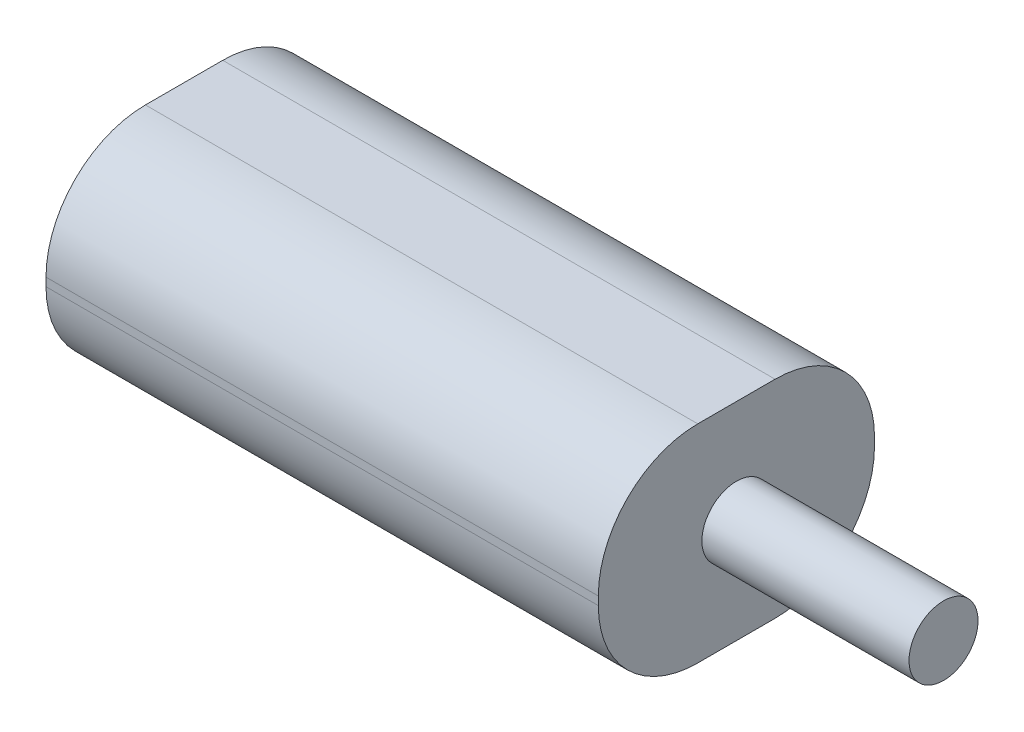
ISO-10303-21;
HEADER;
FILE_DESCRIPTION(('STEP AP214'),'2;1');
FILE_NAME('part.step','',(''),(''),'','','');
FILE_SCHEMA(('AUTOMOTIVE_DESIGN { 1 0 10303 214 1 1 1 1 }'));
ENDSEC;
DATA;
#1=APPLICATION_CONTEXT('core data for automotive mechanical design processes');
#2=APPLICATION_PROTOCOL_DEFINITION('international standard','automotive_design',2000,#1);
#3=PRODUCT_CONTEXT('',#1,'mechanical');
#4=PRODUCT('Part','Part','',(#3));
#5=PRODUCT_RELATED_PRODUCT_CATEGORY('part','',(#4));
#6=PRODUCT_DEFINITION_FORMATION('','',#4);
#7=PRODUCT_DEFINITION_CONTEXT('part definition',#1,'design');
#8=PRODUCT_DEFINITION('design','',#6,#7);
#9=PRODUCT_DEFINITION_SHAPE('','',#8);
#10=(LENGTH_UNIT() NAMED_UNIT(*) SI_UNIT(.MILLI.,.METRE.));
#11=(NAMED_UNIT(*) PLANE_ANGLE_UNIT() SI_UNIT($,.RADIAN.));
#12=(NAMED_UNIT(*) SI_UNIT($,.STERADIAN.) SOLID_ANGLE_UNIT());
#13=UNCERTAINTY_MEASURE_WITH_UNIT(LENGTH_MEASURE(1.E-05),#10,'distance_accuracy_value','');
#14=(GEOMETRIC_REPRESENTATION_CONTEXT(3) GLOBAL_UNCERTAINTY_ASSIGNED_CONTEXT((#13)) GLOBAL_UNIT_ASSIGNED_CONTEXT((#10,
#11,#12)) REPRESENTATION_CONTEXT('',''));
#15=CARTESIAN_POINT('',(0.,0.,0.));
#16=DIRECTION('',(0.,0.,1.));
#17=DIRECTION('',(1.,0.,0.));
#18=AXIS2_PLACEMENT_3D('',#15,#16,#17);
#19=CARTESIAN_POINT('',(-12.7,9.525,-6.35));
#20=DIRECTION('',(1.,0.,0.));
#21=DIRECTION('',(0.,0.,-1.));
#22=AXIS2_PLACEMENT_3D('',#19,#20,#21);
#23=PLANE('',#22);
#24=DIRECTION('',(0.,0.,1.));
#25=VECTOR('',#24,1.);
#26=CARTESIAN_POINT('',(-12.7,9.525,-6.35));
#27=LINE('',#26,#25);
#28=CARTESIAN_POINT('',(-12.7,9.525,-1.778));
#29=VERTEX_POINT('',#28);
#30=CARTESIAN_POINT('',(-12.7,9.525,1.778));
#31=VERTEX_POINT('',#30);
#32=EDGE_CURVE('E120',#29,#31,#27,.T.);
#33=ORIENTED_EDGE('',*,*,#32,.F.);
#34=CARTESIAN_POINT('',(-12.7,4.953,-1.778));
#35=DIRECTION('',(1.,0.,0.));
#36=DIRECTION('',(0.,0.,-1.));
#37=AXIS2_PLACEMENT_3D('',#34,#35,#36);
#38=CIRCLE('',#37,4.572);
#39=CARTESIAN_POINT('',(-12.7,4.953,-6.35));
#40=VERTEX_POINT('',#39);
#41=EDGE_CURVE('E102',#29,#40,#38,.F.);
#42=ORIENTED_EDGE('',*,*,#41,.T.);
#43=DIRECTION('',(0.,-1.,0.));
#44=VECTOR('',#43,1.);
#45=CARTESIAN_POINT('',(-12.7,9.525,-6.35));
#46=LINE('',#45,#44);
#47=CARTESIAN_POINT('',(-12.7,4.572,-6.35));
#48=VERTEX_POINT('',#47);
#49=EDGE_CURVE('E130',#40,#48,#46,.T.);
#50=ORIENTED_EDGE('',*,*,#49,.T.);
#51=CARTESIAN_POINT('',(-12.7,4.572,-1.778));
#52=DIRECTION('',(1.,0.,0.));
#53=DIRECTION('',(0.,0.,-1.));
#54=AXIS2_PLACEMENT_3D('',#51,#52,#53);
#55=CIRCLE('',#54,4.572);
#56=CARTESIAN_POINT('',(-12.7,0.,-1.778));
#57=VERTEX_POINT('',#56);
#58=EDGE_CURVE('E113',#48,#57,#55,.F.);
#59=ORIENTED_EDGE('',*,*,#58,.T.);
#60=DIRECTION('',(0.,0.,1.));
#61=VECTOR('',#60,1.);
#62=CARTESIAN_POINT('',(-12.7,0.,-6.35));
#63=LINE('',#62,#61);
#64=CARTESIAN_POINT('',(-12.7,0.,1.778));
#65=VERTEX_POINT('',#64);
#66=EDGE_CURVE('E133',#57,#65,#63,.T.);
#67=ORIENTED_EDGE('',*,*,#66,.T.);
#68=CARTESIAN_POINT('',(-12.7,4.572,1.778));
#69=DIRECTION('',(1.,0.,0.));
#70=DIRECTION('',(0.,0.,-1.));
#71=AXIS2_PLACEMENT_3D('',#68,#69,#70);
#72=CIRCLE('',#71,4.572);
#73=CARTESIAN_POINT('',(-12.7,4.572,6.35));
#74=VERTEX_POINT('',#73);
#75=EDGE_CURVE('E153',#65,#74,#72,.F.);
#76=ORIENTED_EDGE('',*,*,#75,.T.);
#77=DIRECTION('',(0.,-1.,0.));
#78=VECTOR('',#77,1.);
#79=CARTESIAN_POINT('',(-12.7,9.525,6.35));
#80=LINE('',#79,#78);
#81=CARTESIAN_POINT('',(-12.7,4.953,6.35));
#82=VERTEX_POINT('',#81);
#83=EDGE_CURVE('E148',#82,#74,#80,.T.);
#84=ORIENTED_EDGE('',*,*,#83,.F.);
#85=CARTESIAN_POINT('',(-12.7,4.953,1.778));
#86=DIRECTION('',(1.,0.,0.));
#87=DIRECTION('',(0.,0.,-1.));
#88=AXIS2_PLACEMENT_3D('',#85,#86,#87);
#89=CIRCLE('',#88,4.572);
#90=EDGE_CURVE('E123',#82,#31,#89,.F.);
#91=ORIENTED_EDGE('',*,*,#90,.T.);
#92=EDGE_LOOP('',(#33,#42,#50,#59,#67,#76,#84,#91));
#93=FACE_BOUND('',#92,.T.);
#94=ADVANCED_FACE('F36',(#93),#23,.F.);
#95=CARTESIAN_POINT('',(-12.7,9.525,6.35));
#96=DIRECTION('',(0.,0.,-1.));
#97=DIRECTION('',(-1.,0.,0.));
#98=AXIS2_PLACEMENT_3D('',#95,#96,#97);
#99=PLANE('',#98);
#100=ORIENTED_EDGE('',*,*,#83,.T.);
#101=DIRECTION('',(1.,0.,0.));
#102=VECTOR('',#101,1.);
#103=CARTESIAN_POINT('',(-12.7,4.572,6.35));
#104=LINE('',#103,#102);
#105=CARTESIAN_POINT('',(12.7,4.572,6.35));
#106=VERTEX_POINT('',#105);
#107=EDGE_CURVE('E11',#74,#106,#104,.T.);
#108=ORIENTED_EDGE('',*,*,#107,.T.);
#109=DIRECTION('',(0.,-1.,0.));
#110=VECTOR('',#109,1.);
#111=CARTESIAN_POINT('',(12.7,9.525,6.35));
#112=LINE('',#111,#110);
#113=CARTESIAN_POINT('',(12.7,4.953,6.35));
#114=VERTEX_POINT('',#113);
#115=EDGE_CURVE('E146',#114,#106,#112,.T.);
#116=ORIENTED_EDGE('',*,*,#115,.F.);
#117=DIRECTION('',(1.,0.,0.));
#118=VECTOR('',#117,1.);
#119=CARTESIAN_POINT('',(-12.7,4.953,6.35));
#120=LINE('',#119,#118);
#121=EDGE_CURVE('E44',#114,#82,#120,.F.);
#122=ORIENTED_EDGE('',*,*,#121,.T.);
#123=EDGE_LOOP('',(#100,#108,#116,#122));
#124=FACE_BOUND('',#123,.T.);
#125=ADVANCED_FACE('F170',(#124),#99,.F.);
#126=CARTESIAN_POINT('',(12.7,9.525,-6.35));
#127=DIRECTION('',(-1.,0.,0.));
#128=DIRECTION('',(0.,0.,1.));
#129=AXIS2_PLACEMENT_3D('',#126,#127,#128);
#130=PLANE('',#129);
#131=CARTESIAN_POINT('',(12.7,4.7625,0.));
#132=DIRECTION('',(1.,0.,0.));
#133=DIRECTION('',(0.,0.,-1.));
#134=AXIS2_PLACEMENT_3D('',#131,#132,#133);
#135=CIRCLE('',#134,1.5875);
#136=CARTESIAN_POINT('',(12.7,4.7625,1.5875));
#137=VERTEX_POINT('',#136);
#138=EDGE_CURVE('E136',#137,#137,#135,.T.);
#139=ORIENTED_EDGE('',*,*,#138,.F.);
#140=EDGE_LOOP('',(#139));
#141=FACE_BOUND('',#140,.T.);
#142=DIRECTION('',(0.,-1.,0.));
#143=VECTOR('',#142,1.);
#144=CARTESIAN_POINT('',(12.7,9.525,-6.35));
#145=LINE('',#144,#143);
#146=CARTESIAN_POINT('',(12.7,4.953,-6.35));
#147=VERTEX_POINT('',#146);
#148=CARTESIAN_POINT('',(12.7,4.572,-6.35));
#149=VERTEX_POINT('',#148);
#150=EDGE_CURVE('E143',#147,#149,#145,.T.);
#151=ORIENTED_EDGE('',*,*,#150,.F.);
#152=CARTESIAN_POINT('',(12.7,4.953,-1.778));
#153=DIRECTION('',(-1.,0.,0.));
#154=DIRECTION('',(0.,0.,1.));
#155=AXIS2_PLACEMENT_3D('',#152,#153,#154);
#156=CIRCLE('',#155,4.572);
#157=CARTESIAN_POINT('',(12.7,9.525,-1.778));
#158=VERTEX_POINT('',#157);
#159=EDGE_CURVE('E163',#147,#158,#156,.F.);
#160=ORIENTED_EDGE('',*,*,#159,.T.);
#161=DIRECTION('',(0.,0.,-1.));
#162=VECTOR('',#161,1.);
#163=CARTESIAN_POINT('',(12.7,9.525,-6.35));
#164=LINE('',#163,#162);
#165=CARTESIAN_POINT('',(12.7,9.525,1.778));
#166=VERTEX_POINT('',#165);
#167=EDGE_CURVE('E122',#166,#158,#164,.T.);
#168=ORIENTED_EDGE('',*,*,#167,.F.);
#169=CARTESIAN_POINT('',(12.7,4.953,1.778));
#170=DIRECTION('',(-1.,0.,0.));
#171=DIRECTION('',(0.,0.,1.));
#172=AXIS2_PLACEMENT_3D('',#169,#170,#171);
#173=CIRCLE('',#172,4.572);
#174=EDGE_CURVE('E58',#166,#114,#173,.F.);
#175=ORIENTED_EDGE('',*,*,#174,.T.);
#176=ORIENTED_EDGE('',*,*,#115,.T.);
#177=CARTESIAN_POINT('',(12.7,4.572,1.778));
#178=DIRECTION('',(-1.,0.,0.));
#179=DIRECTION('',(0.,0.,1.));
#180=AXIS2_PLACEMENT_3D('',#177,#178,#179);
#181=CIRCLE('',#180,4.572);
#182=CARTESIAN_POINT('',(12.7,0.,1.778));
#183=VERTEX_POINT('',#182);
#184=EDGE_CURVE('E51',#106,#183,#181,.F.);
#185=ORIENTED_EDGE('',*,*,#184,.T.);
#186=DIRECTION('',(0.,0.,-1.));
#187=VECTOR('',#186,1.);
#188=CARTESIAN_POINT('',(12.7,0.,-6.35));
#189=LINE('',#188,#187);
#190=CARTESIAN_POINT('',(12.7,0.,-1.778));
#191=VERTEX_POINT('',#190);
#192=EDGE_CURVE('E128',#183,#191,#189,.T.);
#193=ORIENTED_EDGE('',*,*,#192,.T.);
#194=CARTESIAN_POINT('',(12.7,4.572,-1.778));
#195=DIRECTION('',(-1.,0.,0.));
#196=DIRECTION('',(0.,0.,1.));
#197=AXIS2_PLACEMENT_3D('',#194,#195,#196);
#198=CIRCLE('',#197,4.572);
#199=EDGE_CURVE('E161',#191,#149,#198,.F.);
#200=ORIENTED_EDGE('',*,*,#199,.T.);
#201=EDGE_LOOP('',(#151,#160,#168,#175,#176,#185,#193,#200));
#202=FACE_BOUND('',#201,.T.);
#203=ADVANCED_FACE('F174',(#141,#202),#130,.F.);
#204=CARTESIAN_POINT('',(-12.7,9.525,-6.35));
#205=DIRECTION('',(0.,0.,1.));
#206=DIRECTION('',(1.,0.,0.));
#207=AXIS2_PLACEMENT_3D('',#204,#205,#206);
#208=PLANE('',#207);
#209=ORIENTED_EDGE('',*,*,#49,.F.);
#210=DIRECTION('',(-1.,0.,0.));
#211=VECTOR('',#210,1.);
#212=CARTESIAN_POINT('',(12.7,4.953,-6.35));
#213=LINE('',#212,#211);
#214=EDGE_CURVE('E107',#40,#147,#213,.F.);
#215=ORIENTED_EDGE('',*,*,#214,.T.);
#216=ORIENTED_EDGE('',*,*,#150,.T.);
#217=DIRECTION('',(-1.,0.,0.));
#218=VECTOR('',#217,1.);
#219=CARTESIAN_POINT('',(-12.7,4.572,-6.35));
#220=LINE('',#219,#218);
#221=EDGE_CURVE('E112',#149,#48,#220,.T.);
#222=ORIENTED_EDGE('',*,*,#221,.T.);
#223=EDGE_LOOP('',(#209,#215,#216,#222));
#224=FACE_BOUND('',#223,.T.);
#225=ADVANCED_FACE('F178',(#224),#208,.F.);
#226=CARTESIAN_POINT('',(0.,9.525,0.));
#227=DIRECTION('',(0.,1.,0.));
#228=DIRECTION('',(0.,0.,1.));
#229=AXIS2_PLACEMENT_3D('',#226,#227,#228);
#230=PLANE('',#229);
#231=ORIENTED_EDGE('',*,*,#167,.T.);
#232=DIRECTION('',(-1.,0.,0.));
#233=VECTOR('',#232,1.);
#234=CARTESIAN_POINT('',(-12.7,9.525,-1.778));
#235=LINE('',#234,#233);
#236=EDGE_CURVE('E106',#158,#29,#235,.T.);
#237=ORIENTED_EDGE('',*,*,#236,.T.);
#238=ORIENTED_EDGE('',*,*,#32,.T.);
#239=DIRECTION('',(1.,0.,0.));
#240=VECTOR('',#239,1.);
#241=CARTESIAN_POINT('',(12.7,9.525,1.778));
#242=LINE('',#241,#240);
#243=EDGE_CURVE('E124',#31,#166,#242,.T.);
#244=ORIENTED_EDGE('',*,*,#243,.T.);
#245=EDGE_LOOP('',(#231,#237,#238,#244));
#246=FACE_BOUND('',#245,.T.);
#247=ADVANCED_FACE('F118',(#246),#230,.T.);
#248=CARTESIAN_POINT('',(0.,0.,0.));
#249=DIRECTION('',(0.,1.,0.));
#250=DIRECTION('',(0.,0.,1.));
#251=AXIS2_PLACEMENT_3D('',#248,#249,#250);
#252=PLANE('',#251);
#253=ORIENTED_EDGE('',*,*,#66,.F.);
#254=DIRECTION('',(-1.,0.,0.));
#255=VECTOR('',#254,1.);
#256=CARTESIAN_POINT('',(0.,0.,-1.778));
#257=LINE('',#256,#255);
#258=EDGE_CURVE('E167',#57,#191,#257,.F.);
#259=ORIENTED_EDGE('',*,*,#258,.T.);
#260=ORIENTED_EDGE('',*,*,#192,.F.);
#261=DIRECTION('',(1.,0.,0.));
#262=VECTOR('',#261,1.);
#263=CARTESIAN_POINT('',(0.,0.,1.778));
#264=LINE('',#263,#262);
#265=EDGE_CURVE('E165',#183,#65,#264,.F.);
#266=ORIENTED_EDGE('',*,*,#265,.T.);
#267=EDGE_LOOP('',(#253,#259,#260,#266));
#268=FACE_BOUND('',#267,.T.);
#269=ADVANCED_FACE('F184',(#268),#252,.F.);
#270=CARTESIAN_POINT('',(22.225,4.7625,0.));
#271=DIRECTION('',(-1.,0.,0.));
#272=DIRECTION('',(0.,0.,1.));
#273=AXIS2_PLACEMENT_3D('',#270,#271,#272);
#274=CYLINDRICAL_SURFACE('',#273,1.5875);
#275=CARTESIAN_POINT('',(22.225,4.7625,0.));
#276=DIRECTION('',(1.,0.,0.));
#277=DIRECTION('',(0.,0.,-1.));
#278=AXIS2_PLACEMENT_3D('',#275,#276,#277);
#279=CIRCLE('',#278,1.5875);
#280=CARTESIAN_POINT('',(22.225,4.7625,1.5875));
#281=VERTEX_POINT('',#280);
#282=EDGE_CURVE('E140',#281,#281,#279,.T.);
#283=CARTESIAN_POINT('',(22.225,4.7625,1.5875));
#284=CARTESIAN_POINT('',(22.12578125,4.7625,1.5875));
#285=CARTESIAN_POINT('',(22.0265625,4.7625,1.5875));
#286=CARTESIAN_POINT('',(21.828125,4.7625,1.5875));
#287=CARTESIAN_POINT('',(21.72890625,4.7625,1.5875));
#288=CARTESIAN_POINT('',(21.53046875,4.7625,1.5875));
#289=CARTESIAN_POINT('',(21.43125,4.7625,1.5875));
#290=CARTESIAN_POINT('',(21.2328125,4.7625,1.5875));
#291=CARTESIAN_POINT('',(21.13359375,4.7625,1.5875));
#292=CARTESIAN_POINT('',(20.93515625,4.7625,1.5875));
#293=CARTESIAN_POINT('',(20.8359375,4.7625,1.5875));
#294=CARTESIAN_POINT('',(20.6375,4.7625,1.5875));
#295=CARTESIAN_POINT('',(20.53828125,4.7625,1.5875));
#296=CARTESIAN_POINT('',(20.33984375,4.7625,1.5875));
#297=CARTESIAN_POINT('',(20.240625,4.7625,1.5875));
#298=CARTESIAN_POINT('',(20.0421875,4.7625,1.5875));
#299=CARTESIAN_POINT('',(19.94296875,4.7625,1.5875));
#300=CARTESIAN_POINT('',(19.74453125,4.7625,1.5875));
#301=CARTESIAN_POINT('',(19.6453125,4.7625,1.5875));
#302=CARTESIAN_POINT('',(19.446875,4.7625,1.5875));
#303=CARTESIAN_POINT('',(19.34765625,4.7625,1.5875));
#304=CARTESIAN_POINT('',(19.14921875,4.7625,1.5875));
#305=CARTESIAN_POINT('',(19.05,4.7625,1.5875));
#306=CARTESIAN_POINT('',(18.8515625,4.7625,1.5875));
#307=CARTESIAN_POINT('',(18.75234375,4.7625,1.5875));
#308=CARTESIAN_POINT('',(18.55390625,4.7625,1.5875));
#309=CARTESIAN_POINT('',(18.4546875,4.7625,1.5875));
#310=CARTESIAN_POINT('',(18.25625,4.7625,1.5875));
#311=CARTESIAN_POINT('',(18.15703125,4.7625,1.5875));
#312=CARTESIAN_POINT('',(17.95859375,4.7625,1.5875));
#313=CARTESIAN_POINT('',(17.859375,4.7625,1.5875));
#314=CARTESIAN_POINT('',(17.6609375,4.7625,1.5875));
#315=CARTESIAN_POINT('',(17.56171875,4.7625,1.5875));
#316=CARTESIAN_POINT('',(17.36328125,4.7625,1.5875));
#317=CARTESIAN_POINT('',(17.2640625,4.7625,1.5875));
#318=CARTESIAN_POINT('',(17.065625,4.7625,1.5875));
#319=CARTESIAN_POINT('',(16.96640625,4.7625,1.5875));
#320=CARTESIAN_POINT('',(16.76796875,4.7625,1.5875));
#321=CARTESIAN_POINT('',(16.66875,4.7625,1.5875));
#322=CARTESIAN_POINT('',(16.4703125,4.7625,1.5875));
#323=CARTESIAN_POINT('',(16.37109375,4.7625,1.5875));
#324=CARTESIAN_POINT('',(16.17265625,4.7625,1.5875));
#325=CARTESIAN_POINT('',(16.0734375,4.7625,1.5875));
#326=CARTESIAN_POINT('',(15.875,4.7625,1.5875));
#327=CARTESIAN_POINT('',(15.77578125,4.7625,1.5875));
#328=CARTESIAN_POINT('',(15.57734375,4.7625,1.5875));
#329=CARTESIAN_POINT('',(15.478125,4.7625,1.5875));
#330=CARTESIAN_POINT('',(15.2796875,4.7625,1.5875));
#331=CARTESIAN_POINT('',(15.18046875,4.7625,1.5875));
#332=CARTESIAN_POINT('',(14.98203125,4.7625,1.5875));
#333=CARTESIAN_POINT('',(14.8828125,4.7625,1.5875));
#334=CARTESIAN_POINT('',(14.684375,4.7625,1.5875));
#335=CARTESIAN_POINT('',(14.58515625,4.7625,1.5875));
#336=CARTESIAN_POINT('',(14.38671875,4.7625,1.5875));
#337=CARTESIAN_POINT('',(14.2875,4.7625,1.5875));
#338=CARTESIAN_POINT('',(14.0890625,4.7625,1.5875));
#339=CARTESIAN_POINT('',(13.98984375,4.7625,1.5875));
#340=CARTESIAN_POINT('',(13.79140625,4.7625,1.5875));
#341=CARTESIAN_POINT('',(13.6921875,4.7625,1.5875));
#342=CARTESIAN_POINT('',(13.49375,4.7625,1.5875));
#343=CARTESIAN_POINT('',(13.39453125,4.7625,1.5875));
#344=CARTESIAN_POINT('',(13.19609375,4.7625,1.5875));
#345=CARTESIAN_POINT('',(13.096875,4.7625,1.5875));
#346=CARTESIAN_POINT('',(12.8984375,4.7625,1.5875));
#347=CARTESIAN_POINT('',(12.79921875,4.7625,1.5875));
#348=CARTESIAN_POINT('',(12.7,4.7625,1.5875));
#349=B_SPLINE_CURVE_WITH_KNOTS('',3,(#283,#284,#285,#286,#287,#288,#289,#290,#291,#292,#293,
#294,#295,#296,#297,#298,#299,#300,#301,#302,#303,#304,#305,#306,#307,#308,#309,#310,#311,#312,
#313,#314,#315,#316,#317,#318,#319,#320,#321,#322,#323,#324,#325,#326,#327,#328,#329,#330,#331,
#332,#333,#334,#335,#336,#337,#338,#339,#340,#341,#342,#343,#344,#345,#346,#347,#348),
.UNSPECIFIED.,.F.,.F.,(4,2,2,2,2,2,2,2,2,2,2,2,2,2,2,2,2,2,2,2,2,2,2,2,2,2,2,2,2,2,2,2,4),(0.,
0.29765625,0.5953125,0.892968750000001,1.190625,1.48828125,1.7859375,2.08359375,2.38125,
2.67890625,2.9765625,3.27421875,3.571875,3.86953125,4.1671875,4.46484375,4.7625,5.06015625,
5.3578125,5.65546875,5.953125,6.25078125,6.5484375,6.84609375,7.14375,7.44140625,7.7390625,
8.03671875,8.334375,8.63203125,8.9296875,9.22734375,9.525),.UNSPECIFIED.);
#350=EDGE_CURVE('BSEAM206',#281,#137,#349,.T.);
#351=ORIENTED_EDGE('',*,*,#282,.F.);
#352=ORIENTED_EDGE('',*,*,#138,.T.);
#353=ORIENTED_EDGE('',*,*,#350,.T.);
#354=ORIENTED_EDGE('',*,*,#350,.F.);
#355=EDGE_LOOP('',(#351,#353,#352,#354));
#356=FACE_BOUND('',#355,.T.);
#357=ADVANCED_FACE('F206',(#356),#274,.T.);
#358=CARTESIAN_POINT('',(22.225,4.7625,0.));
#359=DIRECTION('',(1.,0.,0.));
#360=DIRECTION('',(0.,0.,-1.));
#361=AXIS2_PLACEMENT_3D('',#358,#359,#360);
#362=PLANE('',#361);
#363=ORIENTED_EDGE('',*,*,#282,.T.);
#364=EDGE_LOOP('',(#363));
#365=FACE_BOUND('',#364,.T.);
#366=ADVANCED_FACE('F202',(#365),#362,.T.);
#367=CARTESIAN_POINT('',(0.,4.953,-1.778));
#368=DIRECTION('',(1.,0.,0.));
#369=DIRECTION('',(0.,0.,-1.));
#370=AXIS2_PLACEMENT_3D('',#367,#368,#369);
#371=CYLINDRICAL_SURFACE('',#370,4.572);
#372=ORIENTED_EDGE('',*,*,#159,.F.);
#373=ORIENTED_EDGE('',*,*,#214,.F.);
#374=ORIENTED_EDGE('',*,*,#41,.F.);
#375=ORIENTED_EDGE('',*,*,#236,.F.);
#376=EDGE_LOOP('',(#372,#373,#374,#375));
#377=FACE_BOUND('',#376,.T.);
#378=ADVANCED_FACE('F105',(#377),#371,.T.);
#379=CARTESIAN_POINT('',(-12.7,4.572,-1.778));
#380=DIRECTION('',(-1.,0.,0.));
#381=DIRECTION('',(0.,0.,1.));
#382=AXIS2_PLACEMENT_3D('',#379,#380,#381);
#383=CYLINDRICAL_SURFACE('',#382,4.572);
#384=ORIENTED_EDGE('',*,*,#199,.F.);
#385=ORIENTED_EDGE('',*,*,#258,.F.);
#386=ORIENTED_EDGE('',*,*,#58,.F.);
#387=ORIENTED_EDGE('',*,*,#221,.F.);
#388=EDGE_LOOP('',(#384,#385,#386,#387));
#389=FACE_BOUND('',#388,.T.);
#390=ADVANCED_FACE('F180',(#389),#383,.T.);
#391=CARTESIAN_POINT('',(-12.7,4.572,1.778));
#392=DIRECTION('',(1.,0.,0.));
#393=DIRECTION('',(0.,0.,-1.));
#394=AXIS2_PLACEMENT_3D('',#391,#392,#393);
#395=CYLINDRICAL_SURFACE('',#394,4.572);
#396=ORIENTED_EDGE('',*,*,#75,.F.);
#397=ORIENTED_EDGE('',*,*,#265,.F.);
#398=ORIENTED_EDGE('',*,*,#184,.F.);
#399=ORIENTED_EDGE('',*,*,#107,.F.);
#400=EDGE_LOOP('',(#396,#397,#398,#399));
#401=FACE_BOUND('',#400,.T.);
#402=ADVANCED_FACE('F186',(#401),#395,.T.);
#403=CARTESIAN_POINT('',(0.,4.953,1.778));
#404=DIRECTION('',(-1.,0.,0.));
#405=DIRECTION('',(0.,0.,1.));
#406=AXIS2_PLACEMENT_3D('',#403,#404,#405);
#407=CYLINDRICAL_SURFACE('',#406,4.572);
#408=ORIENTED_EDGE('',*,*,#90,.F.);
#409=ORIENTED_EDGE('',*,*,#121,.F.);
#410=ORIENTED_EDGE('',*,*,#174,.F.);
#411=ORIENTED_EDGE('',*,*,#243,.F.);
#412=EDGE_LOOP('',(#408,#409,#410,#411));
#413=FACE_BOUND('',#412,.T.);
#414=ADVANCED_FACE('F38',(#413),#407,.T.);
#415=CLOSED_SHELL('',(#94,#125,#203,#225,#247,#269,#357,#366,#378,#390,#402,#414));
#416=MANIFOLD_SOLID_BREP('B2',#415);
#417=ADVANCED_BREP_SHAPE_REPRESENTATION('',(#18,#416),#14);
#418=SHAPE_DEFINITION_REPRESENTATION(#9,#417);
ENDSEC;
END-ISO-10303-21;
